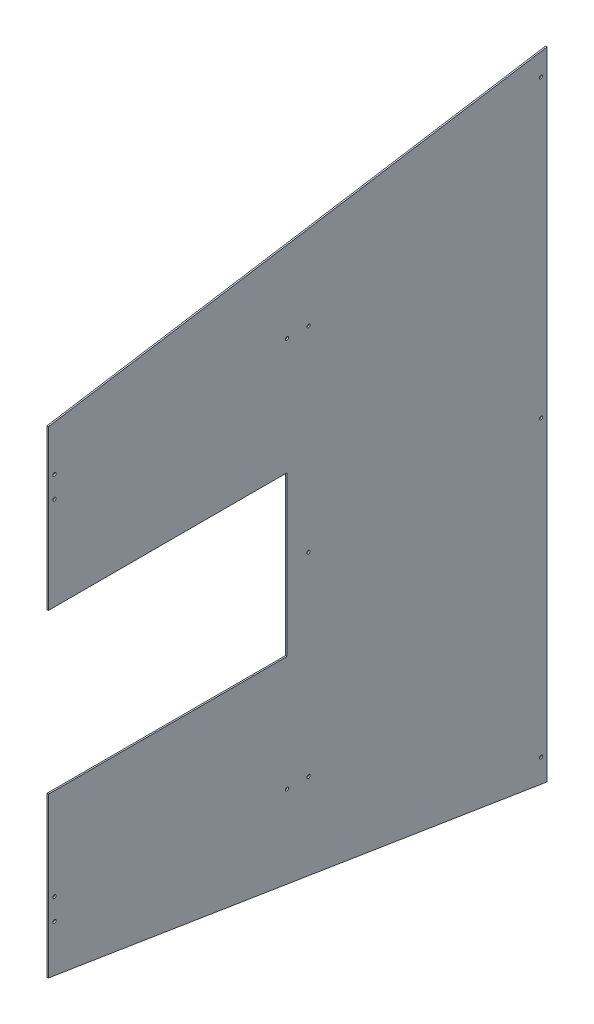
ISO-10303-21;
HEADER;
FILE_DESCRIPTION(('STEP AP214'),'2;1');
FILE_NAME('part.step','',(''),(''),'','','');
FILE_SCHEMA(('AUTOMOTIVE_DESIGN { 1 0 10303 214 1 1 1 1 }'));
ENDSEC;
DATA;
#1=APPLICATION_CONTEXT('core data for automotive mechanical design processes');
#2=APPLICATION_PROTOCOL_DEFINITION('international standard','automotive_design',2000,#1);
#3=PRODUCT_CONTEXT('',#1,'mechanical');
#4=PRODUCT('Part','Part','',(#3));
#5=PRODUCT_RELATED_PRODUCT_CATEGORY('part','',(#4));
#6=PRODUCT_DEFINITION_FORMATION('','',#4);
#7=PRODUCT_DEFINITION_CONTEXT('part definition',#1,'design');
#8=PRODUCT_DEFINITION('design','',#6,#7);
#9=PRODUCT_DEFINITION_SHAPE('','',#8);
#10=(LENGTH_UNIT() NAMED_UNIT(*) SI_UNIT(.MILLI.,.METRE.));
#11=(NAMED_UNIT(*) PLANE_ANGLE_UNIT() SI_UNIT($,.RADIAN.));
#12=(NAMED_UNIT(*) SI_UNIT($,.STERADIAN.) SOLID_ANGLE_UNIT());
#13=UNCERTAINTY_MEASURE_WITH_UNIT(LENGTH_MEASURE(1.E-05),#10,'distance_accuracy_value','');
#14=(GEOMETRIC_REPRESENTATION_CONTEXT(3) GLOBAL_UNCERTAINTY_ASSIGNED_CONTEXT((#13)) GLOBAL_UNIT_ASSIGNED_CONTEXT((#10,
#11,#12)) REPRESENTATION_CONTEXT('',''));
#15=CARTESIAN_POINT('',(0.,0.,0.));
#16=DIRECTION('',(0.,0.,1.));
#17=DIRECTION('',(1.,0.,0.));
#18=AXIS2_PLACEMENT_3D('',#15,#16,#17);
#19=CARTESIAN_POINT('',(0.,0.,0.));
#20=DIRECTION('',(1.,0.,0.));
#21=DIRECTION('',(0.,0.,-1.));
#22=AXIS2_PLACEMENT_3D('',#19,#20,#21);
#23=PLANE('',#22);
#24=CARTESIAN_POINT('',(0.,358.775,1022.35));
#25=DIRECTION('',(-1.,0.,0.));
#26=DIRECTION('',(0.,0.,1.));
#27=AXIS2_PLACEMENT_3D('',#24,#25,#26);
#28=CIRCLE('',#27,3.3655);
#29=CARTESIAN_POINT('',(0.,358.775,1025.7155));
#30=VERTEX_POINT('',#29);
#31=EDGE_CURVE('E138',#30,#30,#28,.F.);
#32=ORIENTED_EDGE('',*,*,#31,.T.);
#33=EDGE_LOOP('',(#32));
#34=FACE_BOUND('',#33,.T.);
#35=CARTESIAN_POINT('',(0.,403.225,1022.35));
#36=DIRECTION('',(-1.,0.,0.));
#37=DIRECTION('',(0.,0.,1.));
#38=AXIS2_PLACEMENT_3D('',#35,#36,#37);
#39=CIRCLE('',#38,3.3655);
#40=CARTESIAN_POINT('',(0.,403.225,1025.7155));
#41=VERTEX_POINT('',#40);
#42=EDGE_CURVE('E142',#41,#41,#39,.F.);
#43=ORIENTED_EDGE('',*,*,#42,.T.);
#44=EDGE_LOOP('',(#43));
#45=FACE_BOUND('',#44,.T.);
#46=CARTESIAN_POINT('',(0.,-355.6,1022.35));
#47=DIRECTION('',(-1.,0.,0.));
#48=DIRECTION('',(0.,0.,1.));
#49=AXIS2_PLACEMENT_3D('',#46,#47,#48);
#50=CIRCLE('',#49,3.3655);
#51=CARTESIAN_POINT('',(0.,-355.6,1025.7155));
#52=VERTEX_POINT('',#51);
#53=EDGE_CURVE('E145',#52,#52,#50,.F.);
#54=ORIENTED_EDGE('',*,*,#53,.T.);
#55=EDGE_LOOP('',(#54));
#56=FACE_BOUND('',#55,.T.);
#57=CARTESIAN_POINT('',(0.,-400.05,1022.35));
#58=DIRECTION('',(-1.,0.,0.));
#59=DIRECTION('',(0.,0.,1.));
#60=AXIS2_PLACEMENT_3D('',#57,#58,#59);
#61=CIRCLE('',#60,3.3655);
#62=CARTESIAN_POINT('',(0.,-400.05,1025.7155));
#63=VERTEX_POINT('',#62);
#64=EDGE_CURVE('E148',#63,#63,#61,.F.);
#65=ORIENTED_EDGE('',*,*,#64,.T.);
#66=EDGE_LOOP('',(#65));
#67=FACE_BOUND('',#66,.T.);
#68=CARTESIAN_POINT('',(0.,-403.225,539.75));
#69=DIRECTION('',(-1.,0.,0.));
#70=DIRECTION('',(0.,0.,1.));
#71=AXIS2_PLACEMENT_3D('',#68,#69,#70);
#72=CIRCLE('',#71,3.3655);
#73=CARTESIAN_POINT('',(0.,-403.225,543.1155));
#74=VERTEX_POINT('',#73);
#75=EDGE_CURVE('E151',#74,#74,#72,.F.);
#76=ORIENTED_EDGE('',*,*,#75,.T.);
#77=EDGE_LOOP('',(#76));
#78=FACE_BOUND('',#77,.T.);
#79=CARTESIAN_POINT('',(0.,-403.225,495.3));
#80=DIRECTION('',(-1.,0.,0.));
#81=DIRECTION('',(0.,0.,1.));
#82=AXIS2_PLACEMENT_3D('',#79,#80,#81);
#83=CIRCLE('',#82,3.3655);
#84=CARTESIAN_POINT('',(0.,-403.225,498.6655));
#85=VERTEX_POINT('',#84);
#86=EDGE_CURVE('E154',#85,#85,#83,.F.);
#87=ORIENTED_EDGE('',*,*,#86,.T.);
#88=EDGE_LOOP('',(#87));
#89=FACE_BOUND('',#88,.T.);
#90=CARTESIAN_POINT('',(0.,0.,495.3));
#91=DIRECTION('',(-1.,0.,0.));
#92=DIRECTION('',(0.,0.,1.));
#93=AXIS2_PLACEMENT_3D('',#90,#91,#92);
#94=CIRCLE('',#93,3.3655);
#95=CARTESIAN_POINT('',(0.,0.,498.6655));
#96=VERTEX_POINT('',#95);
#97=EDGE_CURVE('E157',#96,#96,#94,.F.);
#98=ORIENTED_EDGE('',*,*,#97,.T.);
#99=EDGE_LOOP('',(#98));
#100=FACE_BOUND('',#99,.T.);
#101=CARTESIAN_POINT('',(0.,406.4,539.75));
#102=DIRECTION('',(-1.,0.,0.));
#103=DIRECTION('',(0.,0.,1.));
#104=AXIS2_PLACEMENT_3D('',#101,#102,#103);
#105=CIRCLE('',#104,3.3655);
#106=CARTESIAN_POINT('',(0.,406.4,543.1155));
#107=VERTEX_POINT('',#106);
#108=EDGE_CURVE('E160',#107,#107,#105,.F.);
#109=ORIENTED_EDGE('',*,*,#108,.T.);
#110=EDGE_LOOP('',(#109));
#111=FACE_BOUND('',#110,.T.);
#112=CARTESIAN_POINT('',(0.,406.4,495.3));
#113=DIRECTION('',(-1.,0.,0.));
#114=DIRECTION('',(0.,0.,1.));
#115=AXIS2_PLACEMENT_3D('',#112,#113,#114);
#116=CIRCLE('',#115,3.3655);
#117=CARTESIAN_POINT('',(0.,406.4,498.6655));
#118=VERTEX_POINT('',#117);
#119=EDGE_CURVE('E163',#118,#118,#116,.F.);
#120=ORIENTED_EDGE('',*,*,#119,.T.);
#121=EDGE_LOOP('',(#120));
#122=FACE_BOUND('',#121,.T.);
#123=CARTESIAN_POINT('',(0.,612.775,12.7));
#124=DIRECTION('',(-1.,0.,0.));
#125=DIRECTION('',(0.,0.,1.));
#126=AXIS2_PLACEMENT_3D('',#123,#124,#125);
#127=CIRCLE('',#126,3.3655);
#128=CARTESIAN_POINT('',(0.,612.775,16.0655));
#129=VERTEX_POINT('',#128);
#130=EDGE_CURVE('E166',#129,#129,#127,.F.);
#131=ORIENTED_EDGE('',*,*,#130,.T.);
#132=EDGE_LOOP('',(#131));
#133=FACE_BOUND('',#132,.T.);
#134=CARTESIAN_POINT('',(0.,0.,12.7));
#135=DIRECTION('',(-1.,0.,0.));
#136=DIRECTION('',(0.,0.,1.));
#137=AXIS2_PLACEMENT_3D('',#134,#135,#136);
#138=CIRCLE('',#137,3.3655);
#139=CARTESIAN_POINT('',(0.,0.,16.0655));
#140=VERTEX_POINT('',#139);
#141=EDGE_CURVE('E168',#140,#140,#138,.F.);
#142=ORIENTED_EDGE('',*,*,#141,.T.);
#143=EDGE_LOOP('',(#142));
#144=FACE_BOUND('',#143,.T.);
#145=CARTESIAN_POINT('',(0.,-609.6,12.7));
#146=DIRECTION('',(-1.,0.,0.));
#147=DIRECTION('',(0.,0.,1.));
#148=AXIS2_PLACEMENT_3D('',#145,#146,#147);
#149=CIRCLE('',#148,3.3655);
#150=CARTESIAN_POINT('',(0.,-609.6,16.0655));
#151=VERTEX_POINT('',#150);
#152=EDGE_CURVE('E19',#151,#151,#149,.F.);
#153=ORIENTED_EDGE('',*,*,#152,.T.);
#154=EDGE_LOOP('',(#153));
#155=FACE_BOUND('',#154,.T.);
#156=DIRECTION('',(0.,0.,1.));
#157=VECTOR('',#156,1.);
#158=CARTESIAN_POINT('',(0.,165.1,539.75));
#159=LINE('',#158,#157);
#160=CARTESIAN_POINT('',(0.,165.1,539.75));
#161=VERTEX_POINT('',#160);
#162=CARTESIAN_POINT('',(0.,165.1,1035.05));
#163=VERTEX_POINT('',#162);
#164=EDGE_CURVE('E188',#161,#163,#159,.T.);
#165=ORIENTED_EDGE('',*,*,#164,.T.);
#166=DIRECTION('',(0.,1.,0.));
#167=VECTOR('',#166,1.);
#168=CARTESIAN_POINT('',(0.,495.3,1035.05));
#169=LINE('',#168,#167);
#170=CARTESIAN_POINT('',(0.,495.300000000002,1035.05));
#171=VERTEX_POINT('',#170);
#172=EDGE_CURVE('E190',#171,#163,#169,.F.);
#173=ORIENTED_EDGE('',*,*,#172,.F.);
#174=DIRECTION('',(0.,-0.157517910379392,0.987516130455452));
#175=VECTOR('',#174,1.);
#176=CARTESIAN_POINT('',(0.,660.4,0.));
#177=LINE('',#176,#175);
#178=CARTESIAN_POINT('',(0.,660.4,0.));
#179=VERTEX_POINT('',#178);
#180=EDGE_CURVE('E196',#179,#171,#177,.T.);
#181=ORIENTED_EDGE('',*,*,#180,.F.);
#182=DIRECTION('',(0.,1.,0.));
#183=VECTOR('',#182,1.);
#184=CARTESIAN_POINT('',(0.,-660.4,0.));
#185=LINE('',#184,#183);
#186=CARTESIAN_POINT('',(0.,-660.399999999998,-3.05311331771918E-13));
#187=VERTEX_POINT('',#186);
#188=EDGE_CURVE('E94',#187,#179,#185,.T.);
#189=ORIENTED_EDGE('',*,*,#188,.F.);
#190=DIRECTION('',(0.,-0.157517910379392,-0.987516130455452));
#191=VECTOR('',#190,1.);
#192=CARTESIAN_POINT('',(0.,-495.3,1035.05));
#193=LINE('',#192,#191);
#194=CARTESIAN_POINT('',(0.,-495.3,1035.05));
#195=VERTEX_POINT('',#194);
#196=EDGE_CURVE('E79',#195,#187,#193,.T.);
#197=ORIENTED_EDGE('',*,*,#196,.F.);
#198=DIRECTION('',(0.,1.,0.));
#199=VECTOR('',#198,1.);
#200=CARTESIAN_POINT('',(0.,495.3,1035.05));
#201=LINE('',#200,#199);
#202=CARTESIAN_POINT('',(0.,-165.1,1035.05));
#203=VERTEX_POINT('',#202);
#204=EDGE_CURVE('E84',#203,#195,#201,.F.);
#205=ORIENTED_EDGE('',*,*,#204,.F.);
#206=DIRECTION('',(0.,0.,-1.));
#207=VECTOR('',#206,1.);
#208=CARTESIAN_POINT('',(0.,-165.1,1035.05));
#209=LINE('',#208,#207);
#210=CARTESIAN_POINT('',(0.,-165.1,539.75));
#211=VERTEX_POINT('',#210);
#212=EDGE_CURVE('E176',#203,#211,#209,.T.);
#213=ORIENTED_EDGE('',*,*,#212,.T.);
#214=DIRECTION('',(0.,1.,0.));
#215=VECTOR('',#214,1.);
#216=CARTESIAN_POINT('',(0.,-165.1,539.75));
#217=LINE('',#216,#215);
#218=EDGE_CURVE('E184',#211,#161,#217,.T.);
#219=ORIENTED_EDGE('',*,*,#218,.T.);
#220=EDGE_LOOP('',(#165,#173,#181,#189,#197,#205,#213,#219));
#221=FACE_BOUND('',#220,.T.);
#222=ADVANCED_FACE('F16',(#34,#45,#56,#67,#78,#89,#100,#111,#122,#133,#144,#155,#221),#23,.F.);
#223=CARTESIAN_POINT('',(0.,495.3,1035.05));
#224=DIRECTION('',(0.,0.,1.));
#225=DIRECTION('',(1.,0.,0.));
#226=AXIS2_PLACEMENT_3D('',#223,#224,#225);
#227=PLANE('',#226);
#228=DIRECTION('',(0.,1.,0.));
#229=VECTOR('',#228,1.);
#230=CARTESIAN_POINT('',(3.175,0.,1035.05));
#231=LINE('',#230,#229);
#232=CARTESIAN_POINT('',(3.175,-165.1,1035.05));
#233=VERTEX_POINT('',#232);
#234=CARTESIAN_POINT('',(3.175,-495.3,1035.05));
#235=VERTEX_POINT('',#234);
#236=EDGE_CURVE('E141',#233,#235,#231,.F.);
#237=ORIENTED_EDGE('',*,*,#236,.F.);
#238=DIRECTION('',(1.,0.,0.));
#239=VECTOR('',#238,1.);
#240=CARTESIAN_POINT('',(3.175,-165.1,1035.05));
#241=LINE('',#240,#239);
#242=EDGE_CURVE('E89',#233,#203,#241,.F.);
#243=ORIENTED_EDGE('',*,*,#242,.T.);
#244=ORIENTED_EDGE('',*,*,#204,.T.);
#245=DIRECTION('',(1.,0.,0.));
#246=VECTOR('',#245,1.);
#247=CARTESIAN_POINT('',(0.,-495.3,1035.05));
#248=LINE('',#247,#246);
#249=EDGE_CURVE('E86',#235,#195,#248,.F.);
#250=ORIENTED_EDGE('',*,*,#249,.F.);
#251=EDGE_LOOP('',(#237,#243,#244,#250));
#252=FACE_BOUND('',#251,.T.);
#253=ADVANCED_FACE('F85',(#252),#227,.T.);
#254=CARTESIAN_POINT('',(0.,-495.3,1035.05));
#255=DIRECTION('',(0.,-0.987516130455452,0.157517910379392));
#256=DIRECTION('',(0.,-0.157517910379392,-0.987516130455452));
#257=AXIS2_PLACEMENT_3D('',#254,#255,#256);
#258=PLANE('',#257);
#259=ORIENTED_EDGE('',*,*,#249,.T.);
#260=ORIENTED_EDGE('',*,*,#196,.T.);
#261=DIRECTION('',(-1.,0.,0.));
#262=VECTOR('',#261,1.);
#263=CARTESIAN_POINT('',(0.,-660.4,0.));
#264=LINE('',#263,#262);
#265=CARTESIAN_POINT('',(3.175,-660.399999999998,-3.05311331771918E-13));
#266=VERTEX_POINT('',#265);
#267=EDGE_CURVE('E96',#266,#187,#264,.T.);
#268=ORIENTED_EDGE('',*,*,#267,.F.);
#269=DIRECTION('',(0.,-0.157517910379397,-0.987516130455451));
#270=VECTOR('',#269,1.);
#271=CARTESIAN_POINT('',(3.175,-495.3,1035.05));
#272=LINE('',#271,#270);
#273=EDGE_CURVE('E100',#235,#266,#272,.T.);
#274=ORIENTED_EDGE('',*,*,#273,.F.);
#275=EDGE_LOOP('',(#259,#260,#268,#274));
#276=FACE_BOUND('',#275,.T.);
#277=ADVANCED_FACE('F98',(#276),#258,.T.);
#278=CARTESIAN_POINT('',(0.,-660.4,0.));
#279=DIRECTION('',(0.,0.,-1.));
#280=DIRECTION('',(-1.,0.,0.));
#281=AXIS2_PLACEMENT_3D('',#278,#279,#280);
#282=PLANE('',#281);
#283=ORIENTED_EDGE('',*,*,#267,.T.);
#284=ORIENTED_EDGE('',*,*,#188,.T.);
#285=DIRECTION('',(1.,0.,0.));
#286=VECTOR('',#285,1.);
#287=CARTESIAN_POINT('',(0.,660.4,0.));
#288=LINE('',#287,#286);
#289=CARTESIAN_POINT('',(3.175,660.4,0.));
#290=VERTEX_POINT('',#289);
#291=EDGE_CURVE('E198',#290,#179,#288,.F.);
#292=ORIENTED_EDGE('',*,*,#291,.F.);
#293=DIRECTION('',(0.,1.,0.));
#294=VECTOR('',#293,1.);
#295=CARTESIAN_POINT('',(3.175,0.,0.));
#296=LINE('',#295,#294);
#297=EDGE_CURVE('E205',#266,#290,#296,.T.);
#298=ORIENTED_EDGE('',*,*,#297,.F.);
#299=EDGE_LOOP('',(#283,#284,#292,#298));
#300=FACE_BOUND('',#299,.T.);
#301=ADVANCED_FACE('F203',(#300),#282,.T.);
#302=CARTESIAN_POINT('',(0.,660.4,0.));
#303=DIRECTION('',(0.,0.987516130455452,0.157517910379392));
#304=DIRECTION('',(0.,-0.157517910379392,0.987516130455452));
#305=AXIS2_PLACEMENT_3D('',#302,#303,#304);
#306=PLANE('',#305);
#307=ORIENTED_EDGE('',*,*,#291,.T.);
#308=ORIENTED_EDGE('',*,*,#180,.T.);
#309=DIRECTION('',(1.,0.,0.));
#310=VECTOR('',#309,1.);
#311=CARTESIAN_POINT('',(0.,495.3,1035.05));
#312=LINE('',#311,#310);
#313=CARTESIAN_POINT('',(3.175,495.300000000002,1035.05));
#314=VERTEX_POINT('',#313);
#315=EDGE_CURVE('E193',#314,#171,#312,.F.);
#316=ORIENTED_EDGE('',*,*,#315,.F.);
#317=DIRECTION('',(0.,-0.157517910379397,0.987516130455451));
#318=VECTOR('',#317,1.);
#319=CARTESIAN_POINT('',(3.175,660.4,0.));
#320=LINE('',#319,#318);
#321=EDGE_CURVE('E209',#290,#314,#320,.T.);
#322=ORIENTED_EDGE('',*,*,#321,.F.);
#323=EDGE_LOOP('',(#307,#308,#316,#322));
#324=FACE_BOUND('',#323,.T.);
#325=ADVANCED_FACE('F238',(#324),#306,.T.);
#326=CARTESIAN_POINT('',(0.,495.3,1035.05));
#327=DIRECTION('',(0.,0.,1.));
#328=DIRECTION('',(1.,0.,0.));
#329=AXIS2_PLACEMENT_3D('',#326,#327,#328);
#330=PLANE('',#329);
#331=ORIENTED_EDGE('',*,*,#172,.T.);
#332=DIRECTION('',(1.,0.,0.));
#333=VECTOR('',#332,1.);
#334=CARTESIAN_POINT('',(3.175,165.1,1035.05));
#335=LINE('',#334,#333);
#336=CARTESIAN_POINT('',(3.175,165.1,1035.05));
#337=VERTEX_POINT('',#336);
#338=EDGE_CURVE('E186',#163,#337,#335,.T.);
#339=ORIENTED_EDGE('',*,*,#338,.T.);
#340=DIRECTION('',(0.,1.,0.));
#341=VECTOR('',#340,1.);
#342=CARTESIAN_POINT('',(3.175,0.,1035.05));
#343=LINE('',#342,#341);
#344=EDGE_CURVE('E216',#314,#337,#343,.F.);
#345=ORIENTED_EDGE('',*,*,#344,.F.);
#346=ORIENTED_EDGE('',*,*,#315,.T.);
#347=EDGE_LOOP('',(#331,#339,#345,#346));
#348=FACE_BOUND('',#347,.T.);
#349=ADVANCED_FACE('F235',(#348),#330,.T.);
#350=CARTESIAN_POINT('',(3.175,165.1,539.75));
#351=DIRECTION('',(0.,1.,0.));
#352=DIRECTION('',(0.,0.,1.));
#353=AXIS2_PLACEMENT_3D('',#350,#351,#352);
#354=PLANE('',#353);
#355=DIRECTION('',(0.,0.,-1.));
#356=VECTOR('',#355,1.);
#357=CARTESIAN_POINT('',(3.175,165.1,0.));
#358=LINE('',#357,#356);
#359=CARTESIAN_POINT('',(3.175,165.1,539.75));
#360=VERTEX_POINT('',#359);
#361=EDGE_CURVE('E219',#337,#360,#358,.T.);
#362=ORIENTED_EDGE('',*,*,#361,.F.);
#363=ORIENTED_EDGE('',*,*,#338,.F.);
#364=ORIENTED_EDGE('',*,*,#164,.F.);
#365=DIRECTION('',(-1.,0.,0.));
#366=VECTOR('',#365,1.);
#367=CARTESIAN_POINT('',(3.175,165.1,539.75));
#368=LINE('',#367,#366);
#369=EDGE_CURVE('E182',#161,#360,#368,.F.);
#370=ORIENTED_EDGE('',*,*,#369,.T.);
#371=EDGE_LOOP('',(#362,#363,#364,#370));
#372=FACE_BOUND('',#371,.T.);
#373=ADVANCED_FACE('F231',(#372),#354,.F.);
#374=CARTESIAN_POINT('',(3.175,-165.1,539.75));
#375=DIRECTION('',(0.,0.,-1.));
#376=DIRECTION('',(-1.,0.,0.));
#377=AXIS2_PLACEMENT_3D('',#374,#375,#376);
#378=PLANE('',#377);
#379=DIRECTION('',(0.,1.,0.));
#380=VECTOR('',#379,1.);
#381=CARTESIAN_POINT('',(3.175,0.,539.75));
#382=LINE('',#381,#380);
#383=CARTESIAN_POINT('',(3.175,-165.1,539.75));
#384=VERTEX_POINT('',#383);
#385=EDGE_CURVE('E222',#360,#384,#382,.F.);
#386=ORIENTED_EDGE('',*,*,#385,.F.);
#387=ORIENTED_EDGE('',*,*,#369,.F.);
#388=ORIENTED_EDGE('',*,*,#218,.F.);
#389=DIRECTION('',(1.,0.,0.));
#390=VECTOR('',#389,1.);
#391=CARTESIAN_POINT('',(3.175,-165.1,539.75));
#392=LINE('',#391,#390);
#393=EDGE_CURVE('E34',#211,#384,#392,.T.);
#394=ORIENTED_EDGE('',*,*,#393,.T.);
#395=EDGE_LOOP('',(#386,#387,#388,#394));
#396=FACE_BOUND('',#395,.T.);
#397=ADVANCED_FACE('F228',(#396),#378,.F.);
#398=CARTESIAN_POINT('',(3.175,-165.1,1035.05));
#399=DIRECTION('',(0.,-1.,0.));
#400=DIRECTION('',(0.,0.,-1.));
#401=AXIS2_PLACEMENT_3D('',#398,#399,#400);
#402=PLANE('',#401);
#403=DIRECTION('',(0.,0.,-1.));
#404=VECTOR('',#403,1.);
#405=CARTESIAN_POINT('',(3.175,-165.1,0.));
#406=LINE('',#405,#404);
#407=EDGE_CURVE('E137',#384,#233,#406,.F.);
#408=ORIENTED_EDGE('',*,*,#407,.F.);
#409=ORIENTED_EDGE('',*,*,#393,.F.);
#410=ORIENTED_EDGE('',*,*,#212,.F.);
#411=ORIENTED_EDGE('',*,*,#242,.F.);
#412=EDGE_LOOP('',(#408,#409,#410,#411));
#413=FACE_BOUND('',#412,.T.);
#414=ADVANCED_FACE('F225',(#413),#402,.F.);
#415=CARTESIAN_POINT('',(0.,-609.6,12.7));
#416=DIRECTION('',(-1.,0.,0.));
#417=DIRECTION('',(0.,0.,1.));
#418=AXIS2_PLACEMENT_3D('',#415,#416,#417);
#419=CYLINDRICAL_SURFACE('',#418,3.3655);
#420=CARTESIAN_POINT('',(3.175,-609.6,12.7));
#421=DIRECTION('',(-1.,0.,0.));
#422=DIRECTION('',(0.,0.,1.));
#423=AXIS2_PLACEMENT_3D('',#420,#421,#422);
#424=CIRCLE('',#423,3.3655);
#425=CARTESIAN_POINT('',(3.175,-609.6,16.0655));
#426=VERTEX_POINT('',#425);
#427=EDGE_CURVE('E134',#426,#426,#424,.T.);
#428=ORIENTED_EDGE('',*,*,#427,.F.);
#429=EDGE_LOOP('',(#428));
#430=FACE_BOUND('',#429,.T.);
#431=ORIENTED_EDGE('',*,*,#152,.F.);
#432=EDGE_LOOP('',(#431));
#433=FACE_BOUND('',#432,.T.);
#434=ADVANCED_FACE('F298',(#430,#433),#419,.F.);
#435=CARTESIAN_POINT('',(0.,0.,12.7));
#436=DIRECTION('',(-1.,0.,0.));
#437=DIRECTION('',(0.,0.,1.));
#438=AXIS2_PLACEMENT_3D('',#435,#436,#437);
#439=CYLINDRICAL_SURFACE('',#438,3.3655);
#440=CARTESIAN_POINT('',(3.175,0.,12.7));
#441=DIRECTION('',(-1.,0.,0.));
#442=DIRECTION('',(0.,0.,1.));
#443=AXIS2_PLACEMENT_3D('',#440,#441,#442);
#444=CIRCLE('',#443,3.3655);
#445=CARTESIAN_POINT('',(3.175,0.,16.0655));
#446=VERTEX_POINT('',#445);
#447=EDGE_CURVE('E131',#446,#446,#444,.T.);
#448=ORIENTED_EDGE('',*,*,#447,.F.);
#449=EDGE_LOOP('',(#448));
#450=FACE_BOUND('',#449,.T.);
#451=ORIENTED_EDGE('',*,*,#141,.F.);
#452=EDGE_LOOP('',(#451));
#453=FACE_BOUND('',#452,.T.);
#454=ADVANCED_FACE('F294',(#450,#453),#439,.F.);
#455=CARTESIAN_POINT('',(0.,612.775,12.7));
#456=DIRECTION('',(-1.,0.,0.));
#457=DIRECTION('',(0.,0.,1.));
#458=AXIS2_PLACEMENT_3D('',#455,#456,#457);
#459=CYLINDRICAL_SURFACE('',#458,3.3655);
#460=CARTESIAN_POINT('',(3.175,612.775,12.7));
#461=DIRECTION('',(-1.,0.,0.));
#462=DIRECTION('',(0.,0.,1.));
#463=AXIS2_PLACEMENT_3D('',#460,#461,#462);
#464=CIRCLE('',#463,3.3655);
#465=CARTESIAN_POINT('',(3.175,612.775,16.0655));
#466=VERTEX_POINT('',#465);
#467=EDGE_CURVE('E128',#466,#466,#464,.T.);
#468=ORIENTED_EDGE('',*,*,#467,.F.);
#469=EDGE_LOOP('',(#468));
#470=FACE_BOUND('',#469,.T.);
#471=ORIENTED_EDGE('',*,*,#130,.F.);
#472=EDGE_LOOP('',(#471));
#473=FACE_BOUND('',#472,.T.);
#474=ADVANCED_FACE('F290',(#470,#473),#459,.F.);
#475=CARTESIAN_POINT('',(0.,406.4,495.3));
#476=DIRECTION('',(-1.,0.,0.));
#477=DIRECTION('',(0.,0.,1.));
#478=AXIS2_PLACEMENT_3D('',#475,#476,#477);
#479=CYLINDRICAL_SURFACE('',#478,3.3655);
#480=CARTESIAN_POINT('',(3.175,406.4,495.3));
#481=DIRECTION('',(-1.,0.,0.));
#482=DIRECTION('',(0.,0.,1.));
#483=AXIS2_PLACEMENT_3D('',#480,#481,#482);
#484=CIRCLE('',#483,3.3655);
#485=CARTESIAN_POINT('',(3.175,406.4,498.6655));
#486=VERTEX_POINT('',#485);
#487=EDGE_CURVE('E125',#486,#486,#484,.T.);
#488=ORIENTED_EDGE('',*,*,#487,.F.);
#489=EDGE_LOOP('',(#488));
#490=FACE_BOUND('',#489,.T.);
#491=ORIENTED_EDGE('',*,*,#119,.F.);
#492=EDGE_LOOP('',(#491));
#493=FACE_BOUND('',#492,.T.);
#494=ADVANCED_FACE('F286',(#490,#493),#479,.F.);
#495=CARTESIAN_POINT('',(0.,406.4,539.75));
#496=DIRECTION('',(-1.,0.,0.));
#497=DIRECTION('',(0.,0.,1.));
#498=AXIS2_PLACEMENT_3D('',#495,#496,#497);
#499=CYLINDRICAL_SURFACE('',#498,3.3655);
#500=CARTESIAN_POINT('',(3.175,406.4,539.75));
#501=DIRECTION('',(-1.,0.,0.));
#502=DIRECTION('',(0.,0.,1.));
#503=AXIS2_PLACEMENT_3D('',#500,#501,#502);
#504=CIRCLE('',#503,3.3655);
#505=CARTESIAN_POINT('',(3.175,406.4,543.1155));
#506=VERTEX_POINT('',#505);
#507=EDGE_CURVE('E122',#506,#506,#504,.T.);
#508=ORIENTED_EDGE('',*,*,#507,.F.);
#509=EDGE_LOOP('',(#508));
#510=FACE_BOUND('',#509,.T.);
#511=ORIENTED_EDGE('',*,*,#108,.F.);
#512=EDGE_LOOP('',(#511));
#513=FACE_BOUND('',#512,.T.);
#514=ADVANCED_FACE('F282',(#510,#513),#499,.F.);
#515=CARTESIAN_POINT('',(0.,0.,495.3));
#516=DIRECTION('',(-1.,0.,0.));
#517=DIRECTION('',(0.,0.,1.));
#518=AXIS2_PLACEMENT_3D('',#515,#516,#517);
#519=CYLINDRICAL_SURFACE('',#518,3.3655);
#520=CARTESIAN_POINT('',(3.175,0.,495.3));
#521=DIRECTION('',(-1.,0.,0.));
#522=DIRECTION('',(0.,0.,1.));
#523=AXIS2_PLACEMENT_3D('',#520,#521,#522);
#524=CIRCLE('',#523,3.3655);
#525=CARTESIAN_POINT('',(3.175,0.,498.6655));
#526=VERTEX_POINT('',#525);
#527=EDGE_CURVE('E119',#526,#526,#524,.T.);
#528=ORIENTED_EDGE('',*,*,#527,.F.);
#529=EDGE_LOOP('',(#528));
#530=FACE_BOUND('',#529,.T.);
#531=ORIENTED_EDGE('',*,*,#97,.F.);
#532=EDGE_LOOP('',(#531));
#533=FACE_BOUND('',#532,.T.);
#534=ADVANCED_FACE('F278',(#530,#533),#519,.F.);
#535=CARTESIAN_POINT('',(0.,-403.225,495.3));
#536=DIRECTION('',(-1.,0.,0.));
#537=DIRECTION('',(0.,0.,1.));
#538=AXIS2_PLACEMENT_3D('',#535,#536,#537);
#539=CYLINDRICAL_SURFACE('',#538,3.3655);
#540=CARTESIAN_POINT('',(3.175,-403.225,495.3));
#541=DIRECTION('',(-1.,0.,0.));
#542=DIRECTION('',(0.,0.,1.));
#543=AXIS2_PLACEMENT_3D('',#540,#541,#542);
#544=CIRCLE('',#543,3.3655);
#545=CARTESIAN_POINT('',(3.175,-403.225,498.6655));
#546=VERTEX_POINT('',#545);
#547=EDGE_CURVE('E116',#546,#546,#544,.T.);
#548=ORIENTED_EDGE('',*,*,#547,.F.);
#549=EDGE_LOOP('',(#548));
#550=FACE_BOUND('',#549,.T.);
#551=ORIENTED_EDGE('',*,*,#86,.F.);
#552=EDGE_LOOP('',(#551));
#553=FACE_BOUND('',#552,.T.);
#554=ADVANCED_FACE('F274',(#550,#553),#539,.F.);
#555=CARTESIAN_POINT('',(0.,-403.225,539.75));
#556=DIRECTION('',(-1.,0.,0.));
#557=DIRECTION('',(0.,0.,1.));
#558=AXIS2_PLACEMENT_3D('',#555,#556,#557);
#559=CYLINDRICAL_SURFACE('',#558,3.3655);
#560=CARTESIAN_POINT('',(3.175,-403.225,539.75));
#561=DIRECTION('',(-1.,0.,0.));
#562=DIRECTION('',(0.,0.,1.));
#563=AXIS2_PLACEMENT_3D('',#560,#561,#562);
#564=CIRCLE('',#563,3.3655);
#565=CARTESIAN_POINT('',(3.175,-403.225,543.1155));
#566=VERTEX_POINT('',#565);
#567=EDGE_CURVE('E113',#566,#566,#564,.T.);
#568=ORIENTED_EDGE('',*,*,#567,.F.);
#569=EDGE_LOOP('',(#568));
#570=FACE_BOUND('',#569,.T.);
#571=ORIENTED_EDGE('',*,*,#75,.F.);
#572=EDGE_LOOP('',(#571));
#573=FACE_BOUND('',#572,.T.);
#574=ADVANCED_FACE('F270',(#570,#573),#559,.F.);
#575=CARTESIAN_POINT('',(0.,-400.05,1022.35));
#576=DIRECTION('',(-1.,0.,0.));
#577=DIRECTION('',(0.,0.,1.));
#578=AXIS2_PLACEMENT_3D('',#575,#576,#577);
#579=CYLINDRICAL_SURFACE('',#578,3.3655);
#580=CARTESIAN_POINT('',(3.175,-400.05,1022.35));
#581=DIRECTION('',(-1.,0.,0.));
#582=DIRECTION('',(0.,0.,1.));
#583=AXIS2_PLACEMENT_3D('',#580,#581,#582);
#584=CIRCLE('',#583,3.3655);
#585=CARTESIAN_POINT('',(3.175,-400.05,1025.7155));
#586=VERTEX_POINT('',#585);
#587=EDGE_CURVE('E110',#586,#586,#584,.T.);
#588=ORIENTED_EDGE('',*,*,#587,.F.);
#589=EDGE_LOOP('',(#588));
#590=FACE_BOUND('',#589,.T.);
#591=ORIENTED_EDGE('',*,*,#64,.F.);
#592=EDGE_LOOP('',(#591));
#593=FACE_BOUND('',#592,.T.);
#594=ADVANCED_FACE('F266',(#590,#593),#579,.F.);
#595=CARTESIAN_POINT('',(0.,-355.6,1022.35));
#596=DIRECTION('',(-1.,0.,0.));
#597=DIRECTION('',(0.,0.,1.));
#598=AXIS2_PLACEMENT_3D('',#595,#596,#597);
#599=CYLINDRICAL_SURFACE('',#598,3.3655);
#600=CARTESIAN_POINT('',(3.175,-355.6,1022.35));
#601=DIRECTION('',(-1.,0.,0.));
#602=DIRECTION('',(0.,0.,1.));
#603=AXIS2_PLACEMENT_3D('',#600,#601,#602);
#604=CIRCLE('',#603,3.3655);
#605=CARTESIAN_POINT('',(3.175,-355.6,1025.7155));
#606=VERTEX_POINT('',#605);
#607=EDGE_CURVE('E107',#606,#606,#604,.T.);
#608=ORIENTED_EDGE('',*,*,#607,.F.);
#609=EDGE_LOOP('',(#608));
#610=FACE_BOUND('',#609,.T.);
#611=ORIENTED_EDGE('',*,*,#53,.F.);
#612=EDGE_LOOP('',(#611));
#613=FACE_BOUND('',#612,.T.);
#614=ADVANCED_FACE('F262',(#610,#613),#599,.F.);
#615=CARTESIAN_POINT('',(0.,403.225,1022.35));
#616=DIRECTION('',(-1.,0.,0.));
#617=DIRECTION('',(0.,0.,1.));
#618=AXIS2_PLACEMENT_3D('',#615,#616,#617);
#619=CYLINDRICAL_SURFACE('',#618,3.3655);
#620=CARTESIAN_POINT('',(3.175,403.225,1022.35));
#621=DIRECTION('',(-1.,0.,0.));
#622=DIRECTION('',(0.,0.,1.));
#623=AXIS2_PLACEMENT_3D('',#620,#621,#622);
#624=CIRCLE('',#623,3.3655);
#625=CARTESIAN_POINT('',(3.175,403.225,1025.7155));
#626=VERTEX_POINT('',#625);
#627=EDGE_CURVE('E25',#626,#626,#624,.T.);
#628=ORIENTED_EDGE('',*,*,#627,.F.);
#629=EDGE_LOOP('',(#628));
#630=FACE_BOUND('',#629,.T.);
#631=ORIENTED_EDGE('',*,*,#42,.F.);
#632=EDGE_LOOP('',(#631));
#633=FACE_BOUND('',#632,.T.);
#634=ADVANCED_FACE('F255',(#630,#633),#619,.F.);
#635=CARTESIAN_POINT('',(0.,358.775,1022.35));
#636=DIRECTION('',(-1.,0.,0.));
#637=DIRECTION('',(0.,0.,1.));
#638=AXIS2_PLACEMENT_3D('',#635,#636,#637);
#639=CYLINDRICAL_SURFACE('',#638,3.3655);
#640=CARTESIAN_POINT('',(3.175,358.775,1022.35));
#641=DIRECTION('',(-1.,0.,0.));
#642=DIRECTION('',(0.,0.,1.));
#643=AXIS2_PLACEMENT_3D('',#640,#641,#642);
#644=CIRCLE('',#643,3.3655);
#645=CARTESIAN_POINT('',(3.175,358.775,1025.7155));
#646=VERTEX_POINT('',#645);
#647=EDGE_CURVE('E11',#646,#646,#644,.T.);
#648=ORIENTED_EDGE('',*,*,#647,.F.);
#649=EDGE_LOOP('',(#648));
#650=FACE_BOUND('',#649,.T.);
#651=ORIENTED_EDGE('',*,*,#31,.F.);
#652=EDGE_LOOP('',(#651));
#653=FACE_BOUND('',#652,.T.);
#654=ADVANCED_FACE('F249',(#650,#653),#639,.F.);
#655=CARTESIAN_POINT('',(3.175,0.,0.));
#656=DIRECTION('',(1.,0.,0.));
#657=DIRECTION('',(0.,0.,-1.));
#658=AXIS2_PLACEMENT_3D('',#655,#656,#657);
#659=PLANE('',#658);
#660=ORIENTED_EDGE('',*,*,#647,.T.);
#661=EDGE_LOOP('',(#660));
#662=FACE_BOUND('',#661,.T.);
#663=ORIENTED_EDGE('',*,*,#627,.T.);
#664=EDGE_LOOP('',(#663));
#665=FACE_BOUND('',#664,.T.);
#666=ORIENTED_EDGE('',*,*,#607,.T.);
#667=EDGE_LOOP('',(#666));
#668=FACE_BOUND('',#667,.T.);
#669=ORIENTED_EDGE('',*,*,#587,.T.);
#670=EDGE_LOOP('',(#669));
#671=FACE_BOUND('',#670,.T.);
#672=ORIENTED_EDGE('',*,*,#567,.T.);
#673=EDGE_LOOP('',(#672));
#674=FACE_BOUND('',#673,.T.);
#675=ORIENTED_EDGE('',*,*,#547,.T.);
#676=EDGE_LOOP('',(#675));
#677=FACE_BOUND('',#676,.T.);
#678=ORIENTED_EDGE('',*,*,#527,.T.);
#679=EDGE_LOOP('',(#678));
#680=FACE_BOUND('',#679,.T.);
#681=ORIENTED_EDGE('',*,*,#507,.T.);
#682=EDGE_LOOP('',(#681));
#683=FACE_BOUND('',#682,.T.);
#684=ORIENTED_EDGE('',*,*,#487,.T.);
#685=EDGE_LOOP('',(#684));
#686=FACE_BOUND('',#685,.T.);
#687=ORIENTED_EDGE('',*,*,#467,.T.);
#688=EDGE_LOOP('',(#687));
#689=FACE_BOUND('',#688,.T.);
#690=ORIENTED_EDGE('',*,*,#447,.T.);
#691=EDGE_LOOP('',(#690));
#692=FACE_BOUND('',#691,.T.);
#693=ORIENTED_EDGE('',*,*,#427,.T.);
#694=EDGE_LOOP('',(#693));
#695=FACE_BOUND('',#694,.T.);
#696=ORIENTED_EDGE('',*,*,#385,.T.);
#697=ORIENTED_EDGE('',*,*,#407,.T.);
#698=ORIENTED_EDGE('',*,*,#236,.T.);
#699=ORIENTED_EDGE('',*,*,#273,.T.);
#700=ORIENTED_EDGE('',*,*,#297,.T.);
#701=ORIENTED_EDGE('',*,*,#321,.T.);
#702=ORIENTED_EDGE('',*,*,#344,.T.);
#703=ORIENTED_EDGE('',*,*,#361,.T.);
#704=EDGE_LOOP('',(#696,#697,#698,#699,#700,#701,#702,#703));
#705=FACE_BOUND('',#704,.T.);
#706=ADVANCED_FACE('F212',(#662,#665,#668,#671,#674,#677,#680,#683,#686,#689,#692,#695,#705),
#659,.T.);
#707=CLOSED_SHELL('',(#222,#253,#277,#301,#325,#349,#373,#397,#414,#434,#454,#474,#494,#514,
#534,#554,#574,#594,#614,#634,#654,#706));
#708=MANIFOLD_SOLID_BREP('B1',#707);
#709=ADVANCED_BREP_SHAPE_REPRESENTATION('',(#18,#708),#14);
#710=SHAPE_DEFINITION_REPRESENTATION(#9,#709);
ENDSEC;
END-ISO-10303-21;
